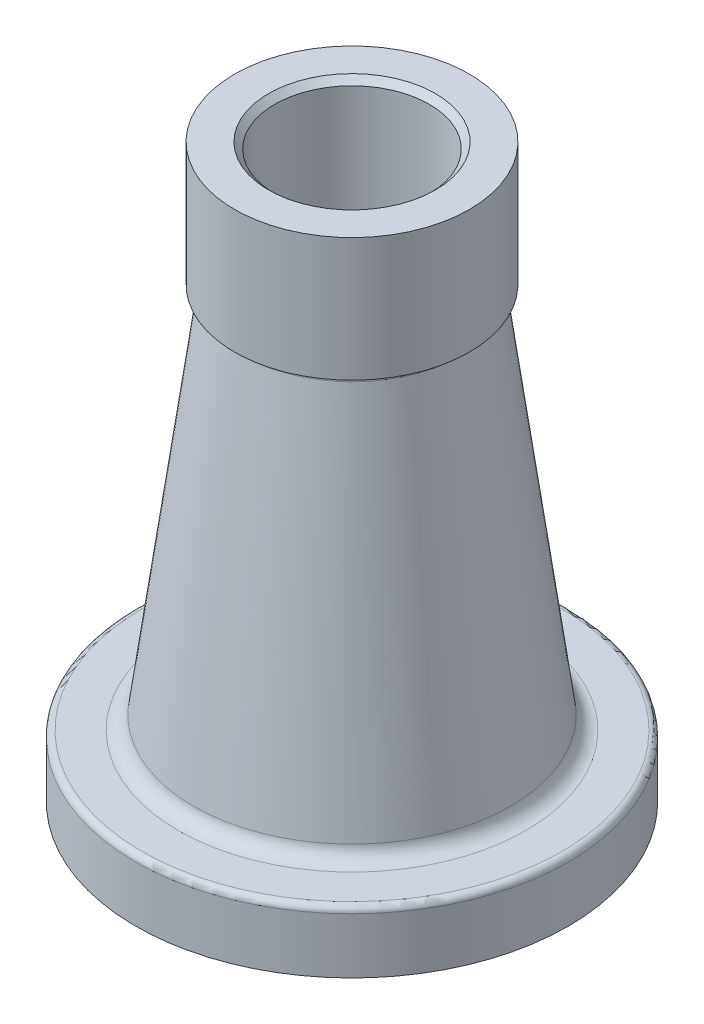
ISO-10303-21;
HEADER;
FILE_DESCRIPTION(('STEP AP214'),'2;1');
FILE_NAME('part.step','',(''),(''),'','','');
FILE_SCHEMA(('AUTOMOTIVE_DESIGN { 1 0 10303 214 1 1 1 1 }'));
ENDSEC;
DATA;
#1=APPLICATION_CONTEXT('core data for automotive mechanical design processes');
#2=APPLICATION_PROTOCOL_DEFINITION('international standard','automotive_design',2000,#1);
#3=PRODUCT_CONTEXT('',#1,'mechanical');
#4=PRODUCT('Part','Part','',(#3));
#5=PRODUCT_RELATED_PRODUCT_CATEGORY('part','',(#4));
#6=PRODUCT_DEFINITION_FORMATION('','',#4);
#7=PRODUCT_DEFINITION_CONTEXT('part definition',#1,'design');
#8=PRODUCT_DEFINITION('design','',#6,#7);
#9=PRODUCT_DEFINITION_SHAPE('','',#8);
#10=(LENGTH_UNIT() NAMED_UNIT(*) SI_UNIT(.MILLI.,.METRE.));
#11=(NAMED_UNIT(*) PLANE_ANGLE_UNIT() SI_UNIT($,.RADIAN.));
#12=(NAMED_UNIT(*) SI_UNIT($,.STERADIAN.) SOLID_ANGLE_UNIT());
#13=UNCERTAINTY_MEASURE_WITH_UNIT(LENGTH_MEASURE(1.E-05),#10,'distance_accuracy_value','');
#14=(GEOMETRIC_REPRESENTATION_CONTEXT(3) GLOBAL_UNCERTAINTY_ASSIGNED_CONTEXT((#13)) GLOBAL_UNIT_ASSIGNED_CONTEXT((#10,
#11,#12)) REPRESENTATION_CONTEXT('',''));
#15=CARTESIAN_POINT('',(0.,0.,0.));
#16=DIRECTION('',(0.,0.,1.));
#17=DIRECTION('',(1.,0.,0.));
#18=AXIS2_PLACEMENT_3D('',#15,#16,#17);
#19=CARTESIAN_POINT('',(0.,-92.5,0.));
#20=DIRECTION('',(0.,-1.,0.));
#21=DIRECTION('',(1.,0.,0.));
#22=AXIS2_PLACEMENT_3D('',#19,#20,#21);
#23=CYLINDRICAL_SURFACE('',#22,25.039844060003);
#24=CARTESIAN_POINT('',(0.,90.5,0.));
#25=DIRECTION('',(0.,-1.,0.));
#26=DIRECTION('',(1.,0.,0.));
#27=AXIS2_PLACEMENT_3D('',#24,#25,#26);
#28=CIRCLE('',#27,25.039844060003);
#29=CARTESIAN_POINT('',(25.0398440600029,90.5,0.));
#30=VERTEX_POINT('',#29);
#31=EDGE_CURVE('E69',#30,#30,#28,.F.);
#32=ORIENTED_EDGE('',*,*,#31,.T.);
#33=EDGE_LOOP('',(#32));
#34=FACE_BOUND('',#33,.T.);
#35=CARTESIAN_POINT('',(0.,52.5,0.));
#36=DIRECTION('',(0.,-1.,0.));
#37=DIRECTION('',(1.,0.,0.));
#38=AXIS2_PLACEMENT_3D('',#35,#36,#37);
#39=CIRCLE('',#38,25.039844060003);
#40=CARTESIAN_POINT('',(25.0398440600029,52.5,0.));
#41=VERTEX_POINT('',#40);
#42=EDGE_CURVE('E81',#41,#41,#39,.T.);
#43=ORIENTED_EDGE('',*,*,#42,.T.);
#44=EDGE_LOOP('',(#43));
#45=FACE_BOUND('',#44,.T.);
#46=ADVANCED_FACE('F43',(#34,#45),#23,.F.);
#47=CARTESIAN_POINT('',(0.,-88.6573090043879,0.));
#48=DIRECTION('',(0.,-1.,0.));
#49=DIRECTION('',(1.,0.,0.));
#50=AXIS2_PLACEMENT_3D('',#47,#48,#49);
#51=CONICAL_SURFACE('',#50,44.,0.133520186248647);
#52=ORIENTED_EDGE('',*,*,#42,.F.);
#53=EDGE_LOOP('',(#52));
#54=FACE_BOUND('',#53,.T.);
#55=CARTESIAN_POINT('',(0.,-88.6573090043879,0.));
#56=DIRECTION('',(0.,-1.,0.));
#57=DIRECTION('',(1.,0.,0.));
#58=AXIS2_PLACEMENT_3D('',#55,#56,#57);
#59=CIRCLE('',#58,44.);
#60=CARTESIAN_POINT('',(44.,-88.6573090043879,0.));
#61=VERTEX_POINT('',#60);
#62=EDGE_CURVE('E84',#61,#61,#59,.T.);
#63=ORIENTED_EDGE('',*,*,#62,.T.);
#64=EDGE_LOOP('',(#63));
#65=FACE_BOUND('',#64,.T.);
#66=ADVANCED_FACE('F118',(#54,#65),#51,.F.);
#67=CARTESIAN_POINT('',(0.,-88.6573090043879,0.));
#68=DIRECTION('',(0.,-1.,0.));
#69=DIRECTION('',(1.,0.,0.));
#70=AXIS2_PLACEMENT_3D('',#67,#68,#69);
#71=PLANE('',#70);
#72=CARTESIAN_POINT('',(0.,-88.6573090043879,0.));
#73=DIRECTION('',(0.,-1.,0.));
#74=DIRECTION('',(1.,0.,0.));
#75=AXIS2_PLACEMENT_3D('',#72,#73,#74);
#76=CIRCLE('',#75,49.);
#77=CARTESIAN_POINT('',(49.,-88.6573090043879,0.));
#78=VERTEX_POINT('',#77);
#79=EDGE_CURVE('E66',#78,#78,#76,.T.);
#80=ORIENTED_EDGE('',*,*,#79,.T.);
#81=EDGE_LOOP('',(#80));
#82=FACE_BOUND('',#81,.T.);
#83=ORIENTED_EDGE('',*,*,#62,.F.);
#84=EDGE_LOOP('',(#83));
#85=FACE_BOUND('',#84,.T.);
#86=ADVANCED_FACE('F124',(#82,#85),#71,.T.);
#87=CARTESIAN_POINT('',(0.,-92.5,0.));
#88=DIRECTION('',(0.,-1.,0.));
#89=DIRECTION('',(1.,0.,0.));
#90=AXIS2_PLACEMENT_3D('',#87,#88,#89);
#91=CYLINDRICAL_SURFACE('',#90,50.);
#92=CARTESIAN_POINT('',(0.,-89.6573090043879,0.));
#93=DIRECTION('',(0.,-1.,0.));
#94=DIRECTION('',(1.,0.,0.));
#95=AXIS2_PLACEMENT_3D('',#92,#93,#94);
#96=CIRCLE('',#95,50.);
#97=CARTESIAN_POINT('',(50.,-89.6573090043879,0.));
#98=VERTEX_POINT('',#97);
#99=EDGE_CURVE('E63',#98,#98,#96,.F.);
#100=ORIENTED_EDGE('',*,*,#99,.T.);
#101=EDGE_LOOP('',(#100));
#102=FACE_BOUND('',#101,.T.);
#103=CARTESIAN_POINT('',(0.,-92.5,0.));
#104=DIRECTION('',(0.,-1.,0.));
#105=DIRECTION('',(1.,0.,0.));
#106=AXIS2_PLACEMENT_3D('',#103,#104,#105);
#107=CIRCLE('',#106,50.);
#108=CARTESIAN_POINT('',(50.,-92.5,0.));
#109=VERTEX_POINT('',#108);
#110=EDGE_CURVE('E87',#109,#109,#107,.T.);
#111=ORIENTED_EDGE('',*,*,#110,.T.);
#112=EDGE_LOOP('',(#111));
#113=FACE_BOUND('',#112,.T.);
#114=ADVANCED_FACE('F160',(#102,#113),#91,.F.);
#115=CARTESIAN_POINT('',(0.,-92.5,0.));
#116=DIRECTION('',(0.,-1.,0.));
#117=DIRECTION('',(1.,0.,0.));
#118=AXIS2_PLACEMENT_3D('',#115,#116,#117);
#119=PLANE('',#118);
#120=CARTESIAN_POINT('',(0.,-92.5,0.));
#121=DIRECTION('',(0.,-1.,0.));
#122=DIRECTION('',(1.,0.,0.));
#123=AXIS2_PLACEMENT_3D('',#120,#121,#122);
#124=CIRCLE('',#123,70.);
#125=CARTESIAN_POINT('',(70.,-92.5,0.));
#126=VERTEX_POINT('',#125);
#127=EDGE_CURVE('E90',#126,#126,#124,.T.);
#128=ORIENTED_EDGE('',*,*,#127,.T.);
#129=EDGE_LOOP('',(#128));
#130=FACE_BOUND('',#129,.T.);
#131=ORIENTED_EDGE('',*,*,#110,.F.);
#132=EDGE_LOOP('',(#131));
#133=FACE_BOUND('',#132,.T.);
#134=ADVANCED_FACE('F154',(#130,#133),#119,.T.);
#135=CARTESIAN_POINT('',(0.,-92.5,0.));
#136=DIRECTION('',(0.,-1.,0.));
#137=DIRECTION('',(1.,0.,0.));
#138=AXIS2_PLACEMENT_3D('',#135,#136,#137);
#139=CYLINDRICAL_SURFACE('',#138,70.);
#140=CARTESIAN_POINT('',(0.,-74.5,0.));
#141=DIRECTION('',(0.,1.,0.));
#142=DIRECTION('',(-1.,0.,0.));
#143=AXIS2_PLACEMENT_3D('',#140,#141,#142);
#144=CIRCLE('',#143,70.);
#145=CARTESIAN_POINT('',(-70.,-74.5,0.));
#146=VERTEX_POINT('',#145);
#147=EDGE_CURVE('E58',#146,#146,#144,.F.);
#148=ORIENTED_EDGE('',*,*,#147,.T.);
#149=EDGE_LOOP('',(#148));
#150=FACE_BOUND('',#149,.T.);
#151=ORIENTED_EDGE('',*,*,#127,.F.);
#152=EDGE_LOOP('',(#151));
#153=FACE_BOUND('',#152,.T.);
#154=ADVANCED_FACE('F150',(#150,#153),#139,.T.);
#155=CARTESIAN_POINT('',(0.,-72.5,0.));
#156=DIRECTION('',(0.,1.,0.));
#157=DIRECTION('',(-1.,0.,0.));
#158=AXIS2_PLACEMENT_3D('',#155,#156,#157);
#159=PLANE('',#158);
#160=CARTESIAN_POINT('',(0.,-72.5,0.));
#161=DIRECTION('',(0.,1.,0.));
#162=DIRECTION('',(-1.,0.,0.));
#163=AXIS2_PLACEMENT_3D('',#160,#161,#162);
#164=CIRCLE('',#163,68.);
#165=CARTESIAN_POINT('',(-68.,-72.5,0.));
#166=VERTEX_POINT('',#165);
#167=EDGE_CURVE('E54',#166,#166,#164,.T.);
#168=ORIENTED_EDGE('',*,*,#167,.T.);
#169=EDGE_LOOP('',(#168));
#170=FACE_BOUND('',#169,.T.);
#171=CARTESIAN_POINT('',(0.,-72.5,0.));
#172=DIRECTION('',(0.,1.,0.));
#173=DIRECTION('',(-1.,0.,0.));
#174=AXIS2_PLACEMENT_3D('',#171,#172,#173);
#175=CIRCLE('',#174,56.2928720709499);
#176=CARTESIAN_POINT('',(-56.2928720709499,-72.5,0.));
#177=VERTEX_POINT('',#176);
#178=EDGE_CURVE('E78',#177,#177,#175,.F.);
#179=ORIENTED_EDGE('',*,*,#178,.T.);
#180=EDGE_LOOP('',(#179));
#181=FACE_BOUND('',#180,.T.);
#182=ADVANCED_FACE('F153',(#170,#181),#159,.T.);
#183=CARTESIAN_POINT('',(0.,-72.5,0.));
#184=DIRECTION('',(0.,-1.,0.));
#185=DIRECTION('',(1.,0.,0.));
#186=AXIS2_PLACEMENT_3D('',#183,#184,#185);
#187=CONICAL_SURFACE('',#186,51.9195661627477,0.133520186248647);
#188=CARTESIAN_POINT('',(0.,50.2337523704796,0.));
#189=DIRECTION('',(0.,-1.,0.));
#190=DIRECTION('',(1.,0.,0.));
#191=AXIS2_PLACEMENT_3D('',#188,#189,#190);
#192=CIRCLE('',#191,35.4340501065233);
#193=CARTESIAN_POINT('',(35.4340501065233,50.2337523704796,0.));
#194=VERTEX_POINT('',#193);
#195=EDGE_CURVE('E50',#194,#194,#192,.T.);
#196=ORIENTED_EDGE('',*,*,#195,.T.);
#197=EDGE_LOOP('',(#196));
#198=FACE_BOUND('',#197,.T.);
#199=CARTESIAN_POINT('',(0.,-68.165619073801,0.));
#200=DIRECTION('',(0.,-1.,0.));
#201=DIRECTION('',(1.,0.,0.));
#202=AXIS2_PLACEMENT_3D('',#199,#200,#201);
#203=CIRCLE('',#202,51.3373749971346);
#204=CARTESIAN_POINT('',(51.3373749971346,-68.165619073801,0.));
#205=VERTEX_POINT('',#204);
#206=EDGE_CURVE('E75',#205,#205,#203,.F.);
#207=ORIENTED_EDGE('',*,*,#206,.T.);
#208=EDGE_LOOP('',(#207));
#209=FACE_BOUND('',#208,.T.);
#210=ADVANCED_FACE('F174',(#198,#209),#187,.T.);
#211=CARTESIAN_POINT('',(0.,52.5,0.));
#212=DIRECTION('',(0.,-1.,0.));
#213=DIRECTION('',(1.,0.,0.));
#214=AXIS2_PLACEMENT_3D('',#211,#212,#213);
#215=PLANE('',#214);
#216=CARTESIAN_POINT('',(0.,52.5,0.));
#217=DIRECTION('',(0.,-1.,0.));
#218=DIRECTION('',(1.,0.,0.));
#219=AXIS2_PLACEMENT_3D('',#216,#217,#218);
#220=CIRCLE('',#219,37.4162489360494);
#221=CARTESIAN_POINT('',(37.4162489360494,52.5,0.));
#222=VERTEX_POINT('',#221);
#223=EDGE_CURVE('E10',#222,#222,#220,.F.);
#224=ORIENTED_EDGE('',*,*,#223,.T.);
#225=EDGE_LOOP('',(#224));
#226=FACE_BOUND('',#225,.T.);
#227=CARTESIAN_POINT('',(0.,52.5,0.));
#228=DIRECTION('',(0.,-1.,0.));
#229=DIRECTION('',(1.,0.,0.));
#230=AXIS2_PLACEMENT_3D('',#227,#228,#229);
#231=CIRCLE('',#230,38.);
#232=CARTESIAN_POINT('',(38.,52.5,0.));
#233=VERTEX_POINT('',#232);
#234=EDGE_CURVE('E93',#233,#233,#231,.T.);
#235=ORIENTED_EDGE('',*,*,#234,.T.);
#236=EDGE_LOOP('',(#235));
#237=FACE_BOUND('',#236,.T.);
#238=ADVANCED_FACE('F114',(#226,#237),#215,.T.);
#239=CARTESIAN_POINT('',(0.,-92.5,0.));
#240=DIRECTION('',(0.,-1.,0.));
#241=DIRECTION('',(1.,0.,0.));
#242=AXIS2_PLACEMENT_3D('',#239,#240,#241);
#243=CYLINDRICAL_SURFACE('',#242,38.);
#244=ORIENTED_EDGE('',*,*,#234,.F.);
#245=EDGE_LOOP('',(#244));
#246=FACE_BOUND('',#245,.T.);
#247=CARTESIAN_POINT('',(0.,92.5,0.));
#248=DIRECTION('',(0.,-1.,0.));
#249=DIRECTION('',(1.,0.,0.));
#250=AXIS2_PLACEMENT_3D('',#247,#248,#249);
#251=CIRCLE('',#250,38.);
#252=CARTESIAN_POINT('',(38.,92.5,0.));
#253=VERTEX_POINT('',#252);
#254=EDGE_CURVE('E96',#253,#253,#251,.T.);
#255=ORIENTED_EDGE('',*,*,#254,.T.);
#256=EDGE_LOOP('',(#255));
#257=FACE_BOUND('',#256,.T.);
#258=ADVANCED_FACE('F100',(#246,#257),#243,.T.);
#259=CARTESIAN_POINT('',(0.,92.5,0.));
#260=DIRECTION('',(0.,-1.,0.));
#261=DIRECTION('',(1.,0.,0.));
#262=AXIS2_PLACEMENT_3D('',#259,#260,#261);
#263=PLANE('',#262);
#264=CARTESIAN_POINT('',(0.,92.5,0.));
#265=DIRECTION('',(0.,-1.,0.));
#266=DIRECTION('',(1.,0.,0.));
#267=AXIS2_PLACEMENT_3D('',#264,#265,#266);
#268=CIRCLE('',#267,27.039844060003);
#269=CARTESIAN_POINT('',(27.0398440600029,92.5,0.));
#270=VERTEX_POINT('',#269);
#271=EDGE_CURVE('E72',#270,#270,#268,.T.);
#272=ORIENTED_EDGE('',*,*,#271,.T.);
#273=EDGE_LOOP('',(#272));
#274=FACE_BOUND('',#273,.T.);
#275=ORIENTED_EDGE('',*,*,#254,.F.);
#276=EDGE_LOOP('',(#275));
#277=FACE_BOUND('',#276,.T.);
#278=ADVANCED_FACE('F102',(#274,#277),#263,.F.);
#279=CARTESIAN_POINT('',(0.,-67.5,0.));
#280=DIRECTION('',(0.,1.,0.));
#281=DIRECTION('',(-1.,0.,0.));
#282=AXIS2_PLACEMENT_3D('',#279,#280,#281);
#283=TOROIDAL_SURFACE('',#282,56.2928720709499,5.);
#284=ORIENTED_EDGE('',*,*,#206,.F.);
#285=EDGE_LOOP('',(#284));
#286=FACE_BOUND('',#285,.T.);
#287=ORIENTED_EDGE('',*,*,#178,.F.);
#288=EDGE_LOOP('',(#287));
#289=FACE_BOUND('',#288,.T.);
#290=ADVANCED_FACE('F104',(#286,#289),#283,.F.);
#291=CARTESIAN_POINT('',(0.,92.5,0.));
#292=DIRECTION('',(0.,1.,0.));
#293=DIRECTION('',(-1.,0.,0.));
#294=AXIS2_PLACEMENT_3D('',#291,#292,#293);
#295=CONICAL_SURFACE('',#294,27.039844060003,0.785398163397449);
#296=ORIENTED_EDGE('',*,*,#31,.F.);
#297=EDGE_LOOP('',(#296));
#298=FACE_BOUND('',#297,.T.);
#299=ORIENTED_EDGE('',*,*,#271,.F.);
#300=EDGE_LOOP('',(#299));
#301=FACE_BOUND('',#300,.T.);
#302=ADVANCED_FACE('F111',(#298,#301),#295,.F.);
#303=CARTESIAN_POINT('',(0.,-89.6573090043879,0.));
#304=DIRECTION('',(0.,-1.,0.));
#305=DIRECTION('',(1.,0.,0.));
#306=AXIS2_PLACEMENT_3D('',#303,#304,#305);
#307=TOROIDAL_SURFACE('',#306,49.,1.);
#308=ORIENTED_EDGE('',*,*,#99,.F.);
#309=EDGE_LOOP('',(#308));
#310=FACE_BOUND('',#309,.T.);
#311=ORIENTED_EDGE('',*,*,#79,.F.);
#312=EDGE_LOOP('',(#311));
#313=FACE_BOUND('',#312,.T.);
#314=ADVANCED_FACE('F135',(#310,#313),#307,.F.);
#315=CARTESIAN_POINT('',(0.,-74.5,0.));
#316=DIRECTION('',(0.,1.,0.));
#317=DIRECTION('',(-1.,0.,0.));
#318=AXIS2_PLACEMENT_3D('',#315,#316,#317);
#319=TOROIDAL_SURFACE('',#318,68.,2.);
#320=ORIENTED_EDGE('',*,*,#167,.F.);
#321=EDGE_LOOP('',(#320));
#322=FACE_BOUND('',#321,.T.);
#323=ORIENTED_EDGE('',*,*,#147,.F.);
#324=EDGE_LOOP('',(#323));
#325=FACE_BOUND('',#324,.T.);
#326=ADVANCED_FACE('F138',(#322,#325),#319,.T.);
#327=CARTESIAN_POINT('',(0.,50.5,0.));
#328=DIRECTION('',(0.,-1.,0.));
#329=DIRECTION('',(1.,0.,0.));
#330=AXIS2_PLACEMENT_3D('',#327,#328,#329);
#331=TOROIDAL_SURFACE('',#330,37.4162489360494,2.);
#332=ORIENTED_EDGE('',*,*,#223,.F.);
#333=EDGE_LOOP('',(#332));
#334=FACE_BOUND('',#333,.T.);
#335=ORIENTED_EDGE('',*,*,#195,.F.);
#336=EDGE_LOOP('',(#335));
#337=FACE_BOUND('',#336,.T.);
#338=ADVANCED_FACE('F45',(#334,#337),#331,.F.);
#339=CLOSED_SHELL('',(#46,#66,#86,#114,#134,#154,#182,#210,#238,#258,#278,#290,#302,#314,#326,#338));
#340=MANIFOLD_SOLID_BREP('B2',#339);
#341=ADVANCED_BREP_SHAPE_REPRESENTATION('',(#18,#340),#14);
#342=SHAPE_DEFINITION_REPRESENTATION(#9,#341);
ENDSEC;
END-ISO-10303-21;
